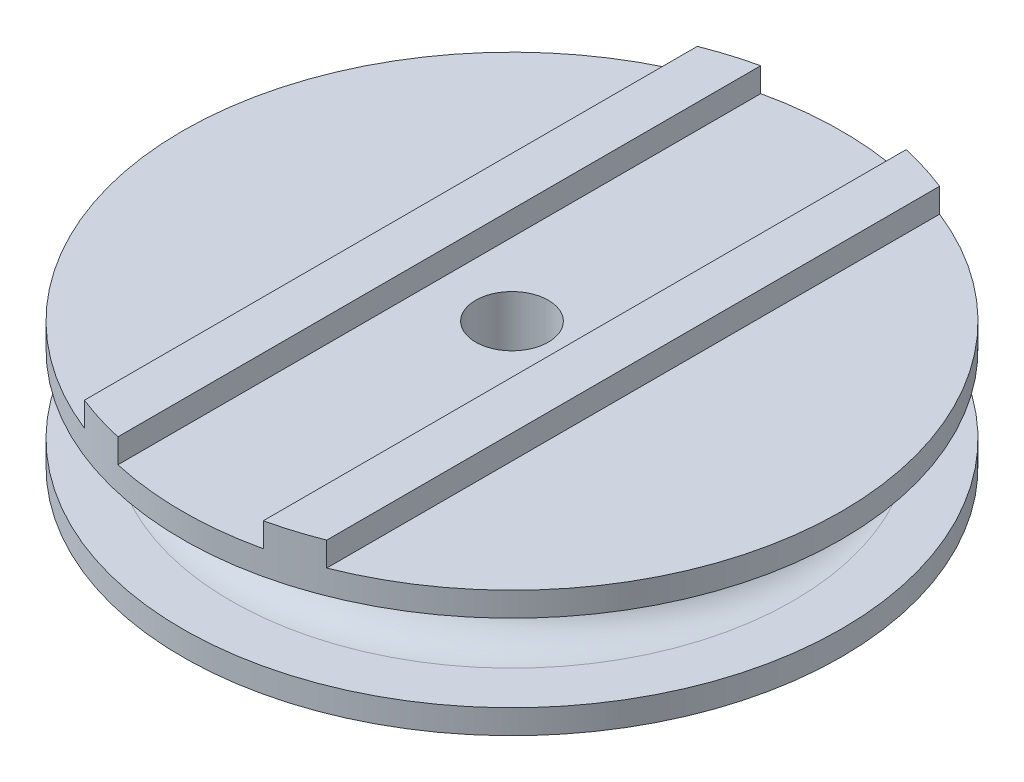
ISO-10303-21;
HEADER;
FILE_DESCRIPTION(('STEP AP214'),'2;1');
FILE_NAME('part.step','',(''),(''),'','','');
FILE_SCHEMA(('AUTOMOTIVE_DESIGN { 1 0 10303 214 1 1 1 1 }'));
ENDSEC;
DATA;
#1=APPLICATION_CONTEXT('core data for automotive mechanical design processes');
#2=APPLICATION_PROTOCOL_DEFINITION('international standard','automotive_design',2000,#1);
#3=PRODUCT_CONTEXT('',#1,'mechanical');
#4=PRODUCT('Part','Part','',(#3));
#5=PRODUCT_RELATED_PRODUCT_CATEGORY('part','',(#4));
#6=PRODUCT_DEFINITION_FORMATION('','',#4);
#7=PRODUCT_DEFINITION_CONTEXT('part definition',#1,'design');
#8=PRODUCT_DEFINITION('design','',#6,#7);
#9=PRODUCT_DEFINITION_SHAPE('','',#8);
#10=(LENGTH_UNIT() NAMED_UNIT(*) SI_UNIT(.MILLI.,.METRE.));
#11=(NAMED_UNIT(*) PLANE_ANGLE_UNIT() SI_UNIT($,.RADIAN.));
#12=(NAMED_UNIT(*) SI_UNIT($,.STERADIAN.) SOLID_ANGLE_UNIT());
#13=UNCERTAINTY_MEASURE_WITH_UNIT(LENGTH_MEASURE(1.E-05),#10,'distance_accuracy_value','');
#14=(GEOMETRIC_REPRESENTATION_CONTEXT(3) GLOBAL_UNCERTAINTY_ASSIGNED_CONTEXT((#13)) GLOBAL_UNIT_ASSIGNED_CONTEXT((#10,
#11,#12)) REPRESENTATION_CONTEXT('',''));
#15=CARTESIAN_POINT('',(0.,0.,0.));
#16=DIRECTION('',(0.,0.,1.));
#17=DIRECTION('',(1.,0.,0.));
#18=AXIS2_PLACEMENT_3D('',#15,#16,#17);
#19=CARTESIAN_POINT('',(0.,5.2,0.));
#20=DIRECTION('',(0.,1.,0.));
#21=DIRECTION('',(-1.,0.,0.));
#22=AXIS2_PLACEMENT_3D('',#19,#20,#21);
#23=PLANE('',#22);
#24=CARTESIAN_POINT('',(0.,5.2,0.));
#25=DIRECTION('',(0.,-1.,0.));
#26=DIRECTION('',(1.,0.,0.));
#27=AXIS2_PLACEMENT_3D('',#24,#25,#26);
#28=CIRCLE('',#27,13.6);
#29=CARTESIAN_POINT('',(-5.,5.2,12.6475294030099));
#30=VERTEX_POINT('',#29);
#31=CARTESIAN_POINT('',(-5.,5.2,-12.6475294030099));
#32=VERTEX_POINT('',#31);
#33=EDGE_CURVE('E41',#30,#32,#28,.T.);
#34=ORIENTED_EDGE('',*,*,#33,.F.);
#35=DIRECTION('',(0.,0.,1.));
#36=VECTOR('',#35,1.);
#37=CARTESIAN_POINT('',(-5.,5.2,-12.6475294030099));
#38=LINE('',#37,#36);
#39=EDGE_CURVE('E202',#32,#30,#38,.T.);
#40=ORIENTED_EDGE('',*,*,#39,.F.);
#41=EDGE_LOOP('',(#34,#40));
#42=FACE_BOUND('',#41,.T.);
#43=ADVANCED_FACE('F33',(#42),#23,.T.);
#44=CARTESIAN_POINT('',(0.,5.2,0.));
#45=DIRECTION('',(0.,1.,0.));
#46=DIRECTION('',(-1.,0.,0.));
#47=AXIS2_PLACEMENT_3D('',#44,#45,#46);
#48=CIRCLE('',#47,1.5);
#49=CARTESIAN_POINT('',(-1.5,5.2,0.));
#50=VERTEX_POINT('',#49);
#51=EDGE_CURVE('E149',#50,#50,#48,.T.);
#52=ORIENTED_EDGE('',*,*,#51,.F.);
#53=EDGE_LOOP('',(#52));
#54=FACE_BOUND('',#53,.T.);
#55=CARTESIAN_POINT('',(-3.,5.2,-13.2649915190323));
#56=VERTEX_POINT('',#55);
#57=CARTESIAN_POINT('',(3.,5.2,-13.2649915190323));
#58=VERTEX_POINT('',#57);
#59=EDGE_CURVE('E170',#56,#58,#28,.T.);
#60=ORIENTED_EDGE('',*,*,#59,.F.);
#61=DIRECTION('',(0.,0.,-1.));
#62=VECTOR('',#61,1.);
#63=CARTESIAN_POINT('',(-3.,5.2,-13.2649915190323));
#64=LINE('',#63,#62);
#65=CARTESIAN_POINT('',(-3.,5.2,13.2649915190323));
#66=VERTEX_POINT('',#65);
#67=EDGE_CURVE('E113',#66,#56,#64,.T.);
#68=ORIENTED_EDGE('',*,*,#67,.F.);
#69=CARTESIAN_POINT('',(3.,5.2,13.2649915190323));
#70=VERTEX_POINT('',#69);
#71=EDGE_CURVE('E11',#70,#66,#28,.T.);
#72=ORIENTED_EDGE('',*,*,#71,.F.);
#73=DIRECTION('',(0.,0.,1.));
#74=VECTOR('',#73,1.);
#75=CARTESIAN_POINT('',(3.,5.2,-13.2649915190323));
#76=LINE('',#75,#74);
#77=EDGE_CURVE('E118',#58,#70,#76,.T.);
#78=ORIENTED_EDGE('',*,*,#77,.F.);
#79=EDGE_LOOP('',(#60,#68,#72,#78));
#80=FACE_BOUND('',#79,.T.);
#81=ADVANCED_FACE('F179',(#54,#80),#23,.T.);
#82=DIRECTION('',(0.,0.,-1.));
#83=VECTOR('',#82,1.);
#84=CARTESIAN_POINT('',(5.,5.2,-12.6475294030099));
#85=LINE('',#84,#83);
#86=CARTESIAN_POINT('',(5.,5.2,12.6475294030099));
#87=VERTEX_POINT('',#86);
#88=CARTESIAN_POINT('',(5.,5.2,-12.6475294030099));
#89=VERTEX_POINT('',#88);
#90=EDGE_CURVE('E121',#87,#89,#85,.T.);
#91=ORIENTED_EDGE('',*,*,#90,.F.);
#92=EDGE_CURVE('E36',#89,#87,#28,.T.);
#93=ORIENTED_EDGE('',*,*,#92,.F.);
#94=EDGE_LOOP('',(#91,#93));
#95=FACE_BOUND('',#94,.T.);
#96=ADVANCED_FACE('F190',(#95),#23,.T.);
#97=CARTESIAN_POINT('',(0.,0.,0.));
#98=DIRECTION('',(0.,-1.,0.));
#99=DIRECTION('',(1.,0.,0.));
#100=AXIS2_PLACEMENT_3D('',#97,#98,#99);
#101=CYLINDRICAL_SURFACE('',#100,13.6);
#102=ORIENTED_EDGE('',*,*,#92,.T.);
#103=DIRECTION('',(0.,-1.,0.));
#104=VECTOR('',#103,1.);
#105=CARTESIAN_POINT('',(5.,6.2,12.6475294030099));
#106=LINE('',#105,#104);
#107=CARTESIAN_POINT('',(5.,6.2,12.6475294030099));
#108=VERTEX_POINT('',#107);
#109=EDGE_CURVE('E140',#108,#87,#106,.T.);
#110=ORIENTED_EDGE('',*,*,#109,.F.);
#111=CARTESIAN_POINT('',(0.,6.2,0.));
#112=DIRECTION('',(0.,1.,0.));
#113=DIRECTION('',(-1.,0.,0.));
#114=AXIS2_PLACEMENT_3D('',#111,#112,#113);
#115=CIRCLE('',#114,13.6);
#116=CARTESIAN_POINT('',(3.,6.2,13.2649915190323));
#117=VERTEX_POINT('',#116);
#118=EDGE_CURVE('E132',#117,#108,#115,.T.);
#119=ORIENTED_EDGE('',*,*,#118,.F.);
#120=DIRECTION('',(0.,-1.,0.));
#121=VECTOR('',#120,1.);
#122=CARTESIAN_POINT('',(3.,6.2,13.2649915190323));
#123=LINE('',#122,#121);
#124=EDGE_CURVE('E143',#117,#70,#123,.T.);
#125=ORIENTED_EDGE('',*,*,#124,.T.);
#126=ORIENTED_EDGE('',*,*,#71,.T.);
#127=DIRECTION('',(0.,-1.,0.));
#128=VECTOR('',#127,1.);
#129=CARTESIAN_POINT('',(-3.,6.2,13.2649915190323));
#130=LINE('',#129,#128);
#131=CARTESIAN_POINT('',(-3.,6.2,13.2649915190323));
#132=VERTEX_POINT('',#131);
#133=EDGE_CURVE('E123',#132,#66,#130,.T.);
#134=ORIENTED_EDGE('',*,*,#133,.F.);
#135=CARTESIAN_POINT('',(0.,6.2,0.));
#136=DIRECTION('',(0.,1.,0.));
#137=DIRECTION('',(1.,0.,0.));
#138=AXIS2_PLACEMENT_3D('',#135,#136,#137);
#139=CIRCLE('',#138,13.6);
#140=CARTESIAN_POINT('',(-5.,6.2,12.6475294030099));
#141=VERTEX_POINT('',#140);
#142=EDGE_CURVE('E104',#141,#132,#139,.T.);
#143=ORIENTED_EDGE('',*,*,#142,.F.);
#144=DIRECTION('',(0.,-1.,0.));
#145=VECTOR('',#144,1.);
#146=CARTESIAN_POINT('',(-5.,6.2,12.6475294030099));
#147=LINE('',#146,#145);
#148=EDGE_CURVE('E48',#141,#30,#147,.T.);
#149=ORIENTED_EDGE('',*,*,#148,.T.);
#150=ORIENTED_EDGE('',*,*,#33,.T.);
#151=DIRECTION('',(0.,-1.,0.));
#152=VECTOR('',#151,1.);
#153=CARTESIAN_POINT('',(-5.,6.2,-12.6475294030099));
#154=LINE('',#153,#152);
#155=CARTESIAN_POINT('',(-5.,6.2,-12.6475294030099));
#156=VERTEX_POINT('',#155);
#157=EDGE_CURVE('E101',#156,#32,#154,.T.);
#158=ORIENTED_EDGE('',*,*,#157,.F.);
#159=CARTESIAN_POINT('',(0.,6.2,0.));
#160=DIRECTION('',(0.,1.,0.));
#161=DIRECTION('',(1.,0.,0.));
#162=AXIS2_PLACEMENT_3D('',#159,#160,#161);
#163=CIRCLE('',#162,13.6);
#164=CARTESIAN_POINT('',(-3.,6.2,-13.2649915190323));
#165=VERTEX_POINT('',#164);
#166=EDGE_CURVE('E105',#165,#156,#163,.T.);
#167=ORIENTED_EDGE('',*,*,#166,.F.);
#168=DIRECTION('',(0.,-1.,0.));
#169=VECTOR('',#168,1.);
#170=CARTESIAN_POINT('',(-3.,6.2,-13.2649915190323));
#171=LINE('',#170,#169);
#172=EDGE_CURVE('E176',#165,#56,#171,.T.);
#173=ORIENTED_EDGE('',*,*,#172,.T.);
#174=ORIENTED_EDGE('',*,*,#59,.T.);
#175=DIRECTION('',(0.,-1.,0.));
#176=VECTOR('',#175,1.);
#177=CARTESIAN_POINT('',(3.,6.2,-13.2649915190323));
#178=LINE('',#177,#176);
#179=CARTESIAN_POINT('',(3.,6.2,-13.2649915190323));
#180=VERTEX_POINT('',#179);
#181=EDGE_CURVE('E146',#180,#58,#178,.T.);
#182=ORIENTED_EDGE('',*,*,#181,.F.);
#183=CARTESIAN_POINT('',(0.,6.2,0.));
#184=DIRECTION('',(0.,1.,0.));
#185=DIRECTION('',(-1.,0.,0.));
#186=AXIS2_PLACEMENT_3D('',#183,#184,#185);
#187=CIRCLE('',#186,13.6);
#188=CARTESIAN_POINT('',(5.,6.2,-12.6475294030099));
#189=VERTEX_POINT('',#188);
#190=EDGE_CURVE('E127',#189,#180,#187,.T.);
#191=ORIENTED_EDGE('',*,*,#190,.F.);
#192=DIRECTION('',(0.,-1.,0.));
#193=VECTOR('',#192,1.);
#194=CARTESIAN_POINT('',(5.,6.2,-12.6475294030099));
#195=LINE('',#194,#193);
#196=EDGE_CURVE('E135',#189,#89,#195,.T.);
#197=ORIENTED_EDGE('',*,*,#196,.T.);
#198=EDGE_LOOP('',(#102,#110,#119,#125,#126,#134,#143,#149,#150,#158,#167,#173,#174,#182,#191,#197));
#199=FACE_BOUND('',#198,.T.);
#200=CARTESIAN_POINT('',(0.,4.2,0.));
#201=DIRECTION('',(0.,-1.,0.));
#202=DIRECTION('',(1.,0.,0.));
#203=AXIS2_PLACEMENT_3D('',#200,#201,#202);
#204=CIRCLE('',#203,13.6);
#205=CARTESIAN_POINT('',(13.6,4.20000000000001,0.));
#206=VERTEX_POINT('',#205);
#207=EDGE_CURVE('E166',#206,#206,#204,.T.);
#208=ORIENTED_EDGE('',*,*,#207,.F.);
#209=EDGE_LOOP('',(#208));
#210=FACE_BOUND('',#209,.T.);
#211=ADVANCED_FACE('F115',(#199,#210),#101,.T.);
#212=CARTESIAN_POINT('',(11.6,4.20000000000001,0.));
#213=DIRECTION('',(0.,-1.,0.));
#214=DIRECTION('',(1.,0.,0.));
#215=AXIS2_PLACEMENT_3D('',#212,#213,#214);
#216=PLANE('',#215);
#217=ORIENTED_EDGE('',*,*,#207,.T.);
#218=EDGE_LOOP('',(#217));
#219=FACE_BOUND('',#218,.T.);
#220=CARTESIAN_POINT('',(0.,4.2,0.));
#221=DIRECTION('',(0.,-1.,0.));
#222=DIRECTION('',(1.,0.,0.));
#223=AXIS2_PLACEMENT_3D('',#220,#221,#222);
#224=CIRCLE('',#223,11.6);
#225=CARTESIAN_POINT('',(11.6,4.2,0.));
#226=VERTEX_POINT('',#225);
#227=EDGE_CURVE('E164',#226,#226,#224,.T.);
#228=ORIENTED_EDGE('',*,*,#227,.F.);
#229=EDGE_LOOP('',(#228));
#230=FACE_BOUND('',#229,.T.);
#231=ADVANCED_FACE('F196',(#219,#230),#216,.T.);
#232=CARTESIAN_POINT('',(0.,2.6,0.));
#233=DIRECTION('',(0.,-1.,0.));
#234=DIRECTION('',(1.,0.,0.));
#235=AXIS2_PLACEMENT_3D('',#232,#233,#234);
#236=TOROIDAL_SURFACE('',#235,11.6,1.6);
#237=ORIENTED_EDGE('',*,*,#227,.T.);
#238=EDGE_LOOP('',(#237));
#239=FACE_BOUND('',#238,.T.);
#240=CARTESIAN_POINT('',(0.,1.,0.));
#241=DIRECTION('',(0.,-1.,0.));
#242=DIRECTION('',(1.,0.,0.));
#243=AXIS2_PLACEMENT_3D('',#240,#241,#242);
#244=CIRCLE('',#243,11.6);
#245=CARTESIAN_POINT('',(11.6,1.,0.));
#246=VERTEX_POINT('',#245);
#247=EDGE_CURVE('E161',#246,#246,#244,.T.);
#248=ORIENTED_EDGE('',*,*,#247,.F.);
#249=EDGE_LOOP('',(#248));
#250=FACE_BOUND('',#249,.T.);
#251=ADVANCED_FACE('F241',(#239,#250),#236,.F.);
#252=CARTESIAN_POINT('',(13.6,1.00000000000001,0.));
#253=DIRECTION('',(0.,1.,0.));
#254=DIRECTION('',(-1.,0.,0.));
#255=AXIS2_PLACEMENT_3D('',#252,#253,#254);
#256=PLANE('',#255);
#257=ORIENTED_EDGE('',*,*,#247,.T.);
#258=EDGE_LOOP('',(#257));
#259=FACE_BOUND('',#258,.T.);
#260=CARTESIAN_POINT('',(0.,1.,0.));
#261=DIRECTION('',(0.,-1.,0.));
#262=DIRECTION('',(1.,0.,0.));
#263=AXIS2_PLACEMENT_3D('',#260,#261,#262);
#264=CIRCLE('',#263,13.6);
#265=CARTESIAN_POINT('',(13.6,1.00000000000001,0.));
#266=VERTEX_POINT('',#265);
#267=EDGE_CURVE('E158',#266,#266,#264,.T.);
#268=ORIENTED_EDGE('',*,*,#267,.F.);
#269=EDGE_LOOP('',(#268));
#270=FACE_BOUND('',#269,.T.);
#271=ADVANCED_FACE('F237',(#259,#270),#256,.T.);
#272=CARTESIAN_POINT('',(0.,0.,0.));
#273=DIRECTION('',(0.,-1.,0.));
#274=DIRECTION('',(1.,0.,0.));
#275=AXIS2_PLACEMENT_3D('',#272,#273,#274);
#276=CYLINDRICAL_SURFACE('',#275,13.6);
#277=ORIENTED_EDGE('',*,*,#267,.T.);
#278=EDGE_LOOP('',(#277));
#279=FACE_BOUND('',#278,.T.);
#280=CARTESIAN_POINT('',(0.,0.,0.));
#281=DIRECTION('',(0.,-1.,0.));
#282=DIRECTION('',(1.,0.,0.));
#283=AXIS2_PLACEMENT_3D('',#280,#281,#282);
#284=CIRCLE('',#283,13.6);
#285=CARTESIAN_POINT('',(13.6,0.,0.));
#286=VERTEX_POINT('',#285);
#287=EDGE_CURVE('E153',#286,#286,#284,.T.);
#288=ORIENTED_EDGE('',*,*,#287,.F.);
#289=EDGE_LOOP('',(#288));
#290=FACE_BOUND('',#289,.T.);
#291=ADVANCED_FACE('F233',(#279,#290),#276,.T.);
#292=CARTESIAN_POINT('',(0.,0.,0.));
#293=DIRECTION('',(0.,-1.,0.));
#294=DIRECTION('',(1.,0.,0.));
#295=AXIS2_PLACEMENT_3D('',#292,#293,#294);
#296=PLANE('',#295);
#297=CARTESIAN_POINT('',(0.,0.,0.));
#298=DIRECTION('',(0.,1.,0.));
#299=DIRECTION('',(-1.,0.,0.));
#300=AXIS2_PLACEMENT_3D('',#297,#298,#299);
#301=CIRCLE('',#300,1.5);
#302=CARTESIAN_POINT('',(-1.5,0.,0.));
#303=VERTEX_POINT('',#302);
#304=EDGE_CURVE('E150',#303,#303,#301,.T.);
#305=ORIENTED_EDGE('',*,*,#304,.T.);
#306=EDGE_LOOP('',(#305));
#307=FACE_BOUND('',#306,.T.);
#308=ORIENTED_EDGE('',*,*,#287,.T.);
#309=EDGE_LOOP('',(#308));
#310=FACE_BOUND('',#309,.T.);
#311=ADVANCED_FACE('F229',(#307,#310),#296,.T.);
#312=CARTESIAN_POINT('',(0.,0.,0.));
#313=DIRECTION('',(0.,1.,0.));
#314=DIRECTION('',(-1.,0.,0.));
#315=AXIS2_PLACEMENT_3D('',#312,#313,#314);
#316=CYLINDRICAL_SURFACE('',#315,1.5);
#317=ORIENTED_EDGE('',*,*,#304,.F.);
#318=EDGE_LOOP('',(#317));
#319=FACE_BOUND('',#318,.T.);
#320=ORIENTED_EDGE('',*,*,#51,.T.);
#321=EDGE_LOOP('',(#320));
#322=FACE_BOUND('',#321,.T.);
#323=ADVANCED_FACE('F226',(#319,#322),#316,.F.);
#324=CARTESIAN_POINT('',(3.,6.2,-13.2649915190323));
#325=DIRECTION('',(1.,0.,0.));
#326=DIRECTION('',(0.,1.,0.));
#327=AXIS2_PLACEMENT_3D('',#324,#325,#326);
#328=PLANE('',#327);
#329=ORIENTED_EDGE('',*,*,#77,.T.);
#330=ORIENTED_EDGE('',*,*,#124,.F.);
#331=DIRECTION('',(0.,0.,1.));
#332=VECTOR('',#331,1.);
#333=CARTESIAN_POINT('',(3.,6.2,-13.2649915190323));
#334=LINE('',#333,#332);
#335=EDGE_CURVE('E130',#180,#117,#334,.T.);
#336=ORIENTED_EDGE('',*,*,#335,.F.);
#337=ORIENTED_EDGE('',*,*,#181,.T.);
#338=EDGE_LOOP('',(#329,#330,#336,#337));
#339=FACE_BOUND('',#338,.T.);
#340=ADVANCED_FACE('F182',(#339),#328,.F.);
#341=CARTESIAN_POINT('',(5.,6.2,-12.6475294030099));
#342=DIRECTION('',(-1.,0.,0.));
#343=DIRECTION('',(0.,-1.,0.));
#344=AXIS2_PLACEMENT_3D('',#341,#342,#343);
#345=PLANE('',#344);
#346=ORIENTED_EDGE('',*,*,#90,.T.);
#347=ORIENTED_EDGE('',*,*,#196,.F.);
#348=DIRECTION('',(0.,0.,-1.));
#349=VECTOR('',#348,1.);
#350=CARTESIAN_POINT('',(5.,6.2,-12.6475294030099));
#351=LINE('',#350,#349);
#352=EDGE_CURVE('E134',#108,#189,#351,.T.);
#353=ORIENTED_EDGE('',*,*,#352,.F.);
#354=ORIENTED_EDGE('',*,*,#109,.T.);
#355=EDGE_LOOP('',(#346,#347,#353,#354));
#356=FACE_BOUND('',#355,.T.);
#357=ADVANCED_FACE('F189',(#356),#345,.F.);
#358=CARTESIAN_POINT('',(0.,6.2,0.));
#359=DIRECTION('',(0.,1.,0.));
#360=DIRECTION('',(-1.,0.,0.));
#361=AXIS2_PLACEMENT_3D('',#358,#359,#360);
#362=PLANE('',#361);
#363=ORIENTED_EDGE('',*,*,#190,.T.);
#364=ORIENTED_EDGE('',*,*,#335,.T.);
#365=ORIENTED_EDGE('',*,*,#118,.T.);
#366=ORIENTED_EDGE('',*,*,#352,.T.);
#367=EDGE_LOOP('',(#363,#364,#365,#366));
#368=FACE_BOUND('',#367,.T.);
#369=ADVANCED_FACE('F185',(#368),#362,.T.);
#370=CARTESIAN_POINT('',(-5.,6.2,-12.6475294030099));
#371=DIRECTION('',(1.,0.,0.));
#372=DIRECTION('',(0.,1.,0.));
#373=AXIS2_PLACEMENT_3D('',#370,#371,#372);
#374=PLANE('',#373);
#375=ORIENTED_EDGE('',*,*,#39,.T.);
#376=ORIENTED_EDGE('',*,*,#148,.F.);
#377=DIRECTION('',(0.,0.,1.));
#378=VECTOR('',#377,1.);
#379=CARTESIAN_POINT('',(-5.,6.2,-12.6475294030099));
#380=LINE('',#379,#378);
#381=EDGE_CURVE('E97',#156,#141,#380,.T.);
#382=ORIENTED_EDGE('',*,*,#381,.F.);
#383=ORIENTED_EDGE('',*,*,#157,.T.);
#384=EDGE_LOOP('',(#375,#376,#382,#383));
#385=FACE_BOUND('',#384,.T.);
#386=ADVANCED_FACE('F99',(#385),#374,.F.);
#387=CARTESIAN_POINT('',(-3.,6.2,-13.2649915190323));
#388=DIRECTION('',(-1.,0.,0.));
#389=DIRECTION('',(0.,-1.,0.));
#390=AXIS2_PLACEMENT_3D('',#387,#388,#389);
#391=PLANE('',#390);
#392=ORIENTED_EDGE('',*,*,#67,.T.);
#393=ORIENTED_EDGE('',*,*,#172,.F.);
#394=DIRECTION('',(0.,0.,-1.));
#395=VECTOR('',#394,1.);
#396=CARTESIAN_POINT('',(-3.,6.2,-13.2649915190323));
#397=LINE('',#396,#395);
#398=EDGE_CURVE('E110',#132,#165,#397,.T.);
#399=ORIENTED_EDGE('',*,*,#398,.F.);
#400=ORIENTED_EDGE('',*,*,#133,.T.);
#401=EDGE_LOOP('',(#392,#393,#399,#400));
#402=FACE_BOUND('',#401,.T.);
#403=ADVANCED_FACE('F210',(#402),#391,.F.);
#404=CARTESIAN_POINT('',(0.,6.2,0.));
#405=DIRECTION('',(0.,-1.,0.));
#406=DIRECTION('',(1.,0.,0.));
#407=AXIS2_PLACEMENT_3D('',#404,#405,#406);
#408=PLANE('',#407);
#409=ORIENTED_EDGE('',*,*,#166,.T.);
#410=ORIENTED_EDGE('',*,*,#381,.T.);
#411=ORIENTED_EDGE('',*,*,#142,.T.);
#412=ORIENTED_EDGE('',*,*,#398,.T.);
#413=EDGE_LOOP('',(#409,#410,#411,#412));
#414=FACE_BOUND('',#413,.T.);
#415=ADVANCED_FACE('F108',(#414),#408,.F.);
#416=CLOSED_SHELL('',(#43,#81,#96,#211,#231,#251,#271,#291,#311,#323,#340,#357,#369,#386,#403,#415));
#417=MANIFOLD_SOLID_BREP('B2',#416);
#418=ADVANCED_BREP_SHAPE_REPRESENTATION('',(#18,#417),#14);
#419=SHAPE_DEFINITION_REPRESENTATION(#9,#418);
ENDSEC;
END-ISO-10303-21;
